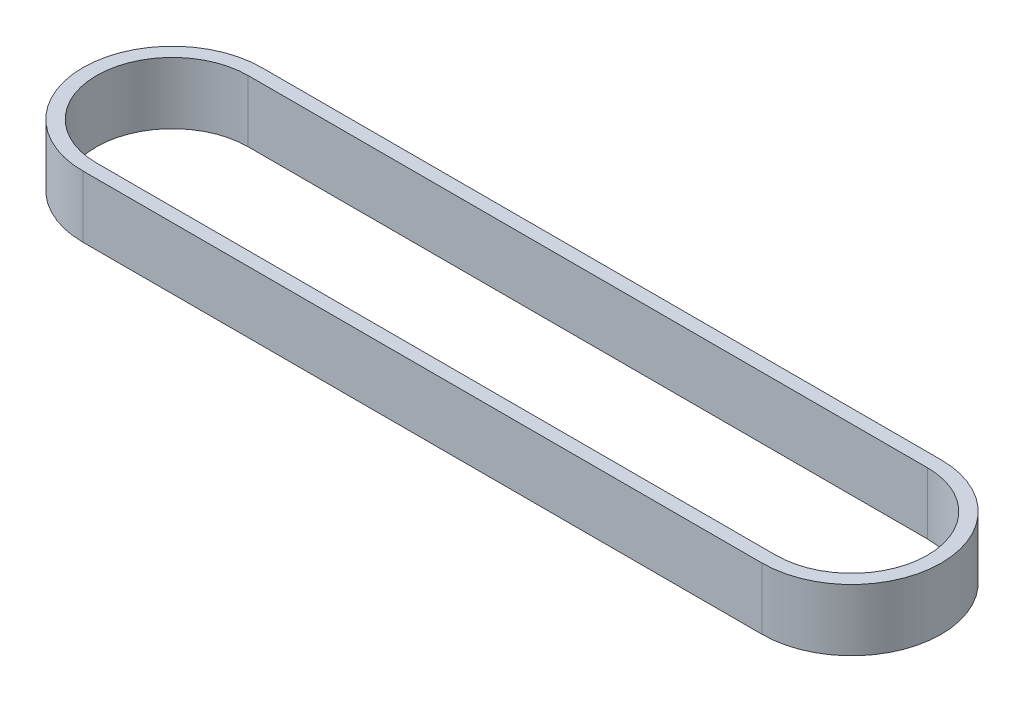
ISO-10303-21;
HEADER;
FILE_DESCRIPTION(('STEP AP214'),'2;1');
FILE_NAME('part.step','',(''),(''),'','','');
FILE_SCHEMA(('AUTOMOTIVE_DESIGN { 1 0 10303 214 1 1 1 1 }'));
ENDSEC;
DATA;
#1=APPLICATION_CONTEXT('core data for automotive mechanical design processes');
#2=APPLICATION_PROTOCOL_DEFINITION('international standard','automotive_design',2000,#1);
#3=PRODUCT_CONTEXT('',#1,'mechanical');
#4=PRODUCT('Part','Part','',(#3));
#5=PRODUCT_RELATED_PRODUCT_CATEGORY('part','',(#4));
#6=PRODUCT_DEFINITION_FORMATION('','',#4);
#7=PRODUCT_DEFINITION_CONTEXT('part definition',#1,'design');
#8=PRODUCT_DEFINITION('design','',#6,#7);
#9=PRODUCT_DEFINITION_SHAPE('','',#8);
#10=(LENGTH_UNIT() NAMED_UNIT(*) SI_UNIT(.MILLI.,.METRE.));
#11=(NAMED_UNIT(*) PLANE_ANGLE_UNIT() SI_UNIT($,.RADIAN.));
#12=(NAMED_UNIT(*) SI_UNIT($,.STERADIAN.) SOLID_ANGLE_UNIT());
#13=UNCERTAINTY_MEASURE_WITH_UNIT(LENGTH_MEASURE(1.E-05),#10,'distance_accuracy_value','');
#14=(GEOMETRIC_REPRESENTATION_CONTEXT(3) GLOBAL_UNCERTAINTY_ASSIGNED_CONTEXT((#13)) GLOBAL_UNIT_ASSIGNED_CONTEXT((#10,
#11,#12)) REPRESENTATION_CONTEXT('',''));
#15=CARTESIAN_POINT('',(0.,0.,0.));
#16=DIRECTION('',(0.,0.,1.));
#17=DIRECTION('',(1.,0.,0.));
#18=AXIS2_PLACEMENT_3D('',#15,#16,#17);
#19=CARTESIAN_POINT('',(49.53,9.,0.));
#20=DIRECTION('',(0.,1.,0.));
#21=DIRECTION('',(0.,0.,1.));
#22=AXIS2_PLACEMENT_3D('',#19,#20,#21);
#23=PLANE('',#22);
#24=CARTESIAN_POINT('',(49.53,9.,0.));
#25=DIRECTION('',(0.,1.,0.));
#26=DIRECTION('',(0.,0.,1.));
#27=AXIS2_PLACEMENT_3D('',#24,#25,#26);
#28=CIRCLE('',#27,13.049);
#29=CARTESIAN_POINT('',(49.53,9.,13.049));
#30=VERTEX_POINT('',#29);
#31=CARTESIAN_POINT('',(49.53,9.,-13.049));
#32=VERTEX_POINT('',#31);
#33=EDGE_CURVE('E134',#30,#32,#28,.T.);
#34=ORIENTED_EDGE('',*,*,#33,.T.);
#35=DIRECTION('',(-1.,0.,0.));
#36=VECTOR('',#35,1.);
#37=CARTESIAN_POINT('',(49.53,9.,-13.049));
#38=LINE('',#37,#36);
#39=CARTESIAN_POINT('',(-49.53,9.,-13.049));
#40=VERTEX_POINT('',#39);
#41=EDGE_CURVE('E137',#32,#40,#38,.T.);
#42=ORIENTED_EDGE('',*,*,#41,.T.);
#43=CARTESIAN_POINT('',(-49.53,9.,0.));
#44=DIRECTION('',(0.,1.,0.));
#45=DIRECTION('',(0.,0.,1.));
#46=AXIS2_PLACEMENT_3D('',#43,#44,#45);
#47=CIRCLE('',#46,13.049);
#48=CARTESIAN_POINT('',(-49.53,9.,13.049));
#49=VERTEX_POINT('',#48);
#50=EDGE_CURVE('E140',#40,#49,#47,.T.);
#51=ORIENTED_EDGE('',*,*,#50,.T.);
#52=DIRECTION('',(1.,0.,0.));
#53=VECTOR('',#52,1.);
#54=CARTESIAN_POINT('',(49.53,9.,13.049));
#55=LINE('',#54,#53);
#56=EDGE_CURVE('E142',#49,#30,#55,.T.);
#57=ORIENTED_EDGE('',*,*,#56,.T.);
#58=EDGE_LOOP('',(#34,#42,#51,#57));
#59=FACE_BOUND('',#58,.T.);
#60=DIRECTION('',(-1.,0.,0.));
#61=VECTOR('',#60,1.);
#62=CARTESIAN_POINT('',(49.53,9.,-11.049));
#63=LINE('',#62,#61);
#64=CARTESIAN_POINT('',(49.53,9.,-11.049));
#65=VERTEX_POINT('',#64);
#66=CARTESIAN_POINT('',(-49.53,9.,-11.049));
#67=VERTEX_POINT('',#66);
#68=EDGE_CURVE('E106',#65,#67,#63,.T.);
#69=ORIENTED_EDGE('',*,*,#68,.F.);
#70=CARTESIAN_POINT('',(49.53,9.,0.));
#71=DIRECTION('',(0.,1.,0.));
#72=DIRECTION('',(0.,0.,1.));
#73=AXIS2_PLACEMENT_3D('',#70,#71,#72);
#74=CIRCLE('',#73,11.049);
#75=CARTESIAN_POINT('',(49.53,9.,11.049));
#76=VERTEX_POINT('',#75);
#77=EDGE_CURVE('E98',#76,#65,#74,.T.);
#78=ORIENTED_EDGE('',*,*,#77,.F.);
#79=DIRECTION('',(1.,0.,0.));
#80=VECTOR('',#79,1.);
#81=CARTESIAN_POINT('',(49.53,9.,11.049));
#82=LINE('',#81,#80);
#83=CARTESIAN_POINT('',(-49.53,9.,11.049));
#84=VERTEX_POINT('',#83);
#85=EDGE_CURVE('E120',#84,#76,#82,.T.);
#86=ORIENTED_EDGE('',*,*,#85,.F.);
#87=CARTESIAN_POINT('',(-49.53,9.,0.));
#88=DIRECTION('',(0.,1.,0.));
#89=DIRECTION('',(0.,0.,1.));
#90=AXIS2_PLACEMENT_3D('',#87,#88,#89);
#91=CIRCLE('',#90,11.049);
#92=EDGE_CURVE('E118',#67,#84,#91,.T.);
#93=ORIENTED_EDGE('',*,*,#92,.F.);
#94=EDGE_LOOP('',(#69,#78,#86,#93));
#95=FACE_BOUND('',#94,.T.);
#96=ADVANCED_FACE('F33',(#59,#95),#23,.T.);
#97=CARTESIAN_POINT('',(49.53,0.,0.));
#98=DIRECTION('',(0.,1.,0.));
#99=DIRECTION('',(0.,0.,1.));
#100=AXIS2_PLACEMENT_3D('',#97,#98,#99);
#101=PLANE('',#100);
#102=CARTESIAN_POINT('',(49.53,0.,0.));
#103=DIRECTION('',(0.,1.,0.));
#104=DIRECTION('',(0.,0.,1.));
#105=AXIS2_PLACEMENT_3D('',#102,#103,#104);
#106=CIRCLE('',#105,13.049);
#107=CARTESIAN_POINT('',(49.53,0.,13.049));
#108=VERTEX_POINT('',#107);
#109=CARTESIAN_POINT('',(49.53,0.,-13.049));
#110=VERTEX_POINT('',#109);
#111=EDGE_CURVE('E114',#108,#110,#106,.T.);
#112=ORIENTED_EDGE('',*,*,#111,.F.);
#113=DIRECTION('',(1.,0.,0.));
#114=VECTOR('',#113,1.);
#115=CARTESIAN_POINT('',(49.53,0.,13.049));
#116=LINE('',#115,#114);
#117=CARTESIAN_POINT('',(-49.53,0.,13.049));
#118=VERTEX_POINT('',#117);
#119=EDGE_CURVE('E138',#118,#108,#116,.T.);
#120=ORIENTED_EDGE('',*,*,#119,.F.);
#121=CARTESIAN_POINT('',(-49.53,0.,0.));
#122=DIRECTION('',(0.,1.,0.));
#123=DIRECTION('',(0.,0.,1.));
#124=AXIS2_PLACEMENT_3D('',#121,#122,#123);
#125=CIRCLE('',#124,13.049);
#126=CARTESIAN_POINT('',(-49.53,0.,-13.049));
#127=VERTEX_POINT('',#126);
#128=EDGE_CURVE('E149',#127,#118,#125,.T.);
#129=ORIENTED_EDGE('',*,*,#128,.F.);
#130=DIRECTION('',(-1.,0.,0.));
#131=VECTOR('',#130,1.);
#132=CARTESIAN_POINT('',(49.53,0.,-13.049));
#133=LINE('',#132,#131);
#134=EDGE_CURVE('E147',#110,#127,#133,.T.);
#135=ORIENTED_EDGE('',*,*,#134,.F.);
#136=EDGE_LOOP('',(#112,#120,#129,#135));
#137=FACE_BOUND('',#136,.T.);
#138=CARTESIAN_POINT('',(49.53,0.,0.));
#139=DIRECTION('',(0.,1.,0.));
#140=DIRECTION('',(0.,0.,1.));
#141=AXIS2_PLACEMENT_3D('',#138,#139,#140);
#142=CIRCLE('',#141,11.049);
#143=CARTESIAN_POINT('',(49.53,0.,11.049));
#144=VERTEX_POINT('',#143);
#145=CARTESIAN_POINT('',(49.53,0.,-11.049));
#146=VERTEX_POINT('',#145);
#147=EDGE_CURVE('E56',#144,#146,#142,.T.);
#148=ORIENTED_EDGE('',*,*,#147,.T.);
#149=DIRECTION('',(-1.,0.,0.));
#150=VECTOR('',#149,1.);
#151=CARTESIAN_POINT('',(49.53,0.,-11.049));
#152=LINE('',#151,#150);
#153=CARTESIAN_POINT('',(-49.53,0.,-11.049));
#154=VERTEX_POINT('',#153);
#155=EDGE_CURVE('E113',#146,#154,#152,.T.);
#156=ORIENTED_EDGE('',*,*,#155,.T.);
#157=CARTESIAN_POINT('',(-49.53,0.,0.));
#158=DIRECTION('',(0.,1.,0.));
#159=DIRECTION('',(0.,0.,1.));
#160=AXIS2_PLACEMENT_3D('',#157,#158,#159);
#161=CIRCLE('',#160,11.049);
#162=CARTESIAN_POINT('',(-49.53,0.,11.049));
#163=VERTEX_POINT('',#162);
#164=EDGE_CURVE('E126',#154,#163,#161,.T.);
#165=ORIENTED_EDGE('',*,*,#164,.T.);
#166=DIRECTION('',(1.,0.,0.));
#167=VECTOR('',#166,1.);
#168=CARTESIAN_POINT('',(49.53,0.,11.049));
#169=LINE('',#168,#167);
#170=EDGE_CURVE('E107',#163,#144,#169,.T.);
#171=ORIENTED_EDGE('',*,*,#170,.T.);
#172=EDGE_LOOP('',(#148,#156,#165,#171));
#173=FACE_BOUND('',#172,.T.);
#174=ADVANCED_FACE('F167',(#137,#173),#101,.F.);
#175=CARTESIAN_POINT('',(49.53,9.,0.));
#176=DIRECTION('',(0.,-1.,0.));
#177=DIRECTION('',(0.,0.,-1.));
#178=AXIS2_PLACEMENT_3D('',#175,#176,#177);
#179=CYLINDRICAL_SURFACE('',#178,13.049);
#180=ORIENTED_EDGE('',*,*,#111,.T.);
#181=DIRECTION('',(0.,-1.,0.));
#182=VECTOR('',#181,1.);
#183=CARTESIAN_POINT('',(49.53,9.,-13.049));
#184=LINE('',#183,#182);
#185=EDGE_CURVE('E11',#32,#110,#184,.T.);
#186=ORIENTED_EDGE('',*,*,#185,.F.);
#187=ORIENTED_EDGE('',*,*,#33,.F.);
#188=DIRECTION('',(0.,-1.,0.));
#189=VECTOR('',#188,1.);
#190=CARTESIAN_POINT('',(49.53,9.,13.049));
#191=LINE('',#190,#189);
#192=EDGE_CURVE('E144',#30,#108,#191,.T.);
#193=ORIENTED_EDGE('',*,*,#192,.T.);
#194=EDGE_LOOP('',(#180,#186,#187,#193));
#195=FACE_BOUND('',#194,.T.);
#196=ADVANCED_FACE('F35',(#195),#179,.T.);
#197=CARTESIAN_POINT('',(49.53,9.,-13.049));
#198=DIRECTION('',(0.,0.,1.));
#199=DIRECTION('',(1.,0.,0.));
#200=AXIS2_PLACEMENT_3D('',#197,#198,#199);
#201=PLANE('',#200);
#202=ORIENTED_EDGE('',*,*,#134,.T.);
#203=DIRECTION('',(0.,-1.,0.));
#204=VECTOR('',#203,1.);
#205=CARTESIAN_POINT('',(-49.53,9.,-13.049));
#206=LINE('',#205,#204);
#207=EDGE_CURVE('E41',#40,#127,#206,.T.);
#208=ORIENTED_EDGE('',*,*,#207,.F.);
#209=ORIENTED_EDGE('',*,*,#41,.F.);
#210=ORIENTED_EDGE('',*,*,#185,.T.);
#211=EDGE_LOOP('',(#202,#208,#209,#210));
#212=FACE_BOUND('',#211,.T.);
#213=ADVANCED_FACE('F177',(#212),#201,.F.);
#214=CARTESIAN_POINT('',(-49.53,9.,0.));
#215=DIRECTION('',(0.,-1.,0.));
#216=DIRECTION('',(0.,0.,-1.));
#217=AXIS2_PLACEMENT_3D('',#214,#215,#216);
#218=CYLINDRICAL_SURFACE('',#217,13.049);
#219=ORIENTED_EDGE('',*,*,#128,.T.);
#220=DIRECTION('',(0.,-1.,0.));
#221=VECTOR('',#220,1.);
#222=CARTESIAN_POINT('',(-49.53,9.,13.049));
#223=LINE('',#222,#221);
#224=EDGE_CURVE('E154',#49,#118,#223,.T.);
#225=ORIENTED_EDGE('',*,*,#224,.F.);
#226=ORIENTED_EDGE('',*,*,#50,.F.);
#227=ORIENTED_EDGE('',*,*,#207,.T.);
#228=EDGE_LOOP('',(#219,#225,#226,#227));
#229=FACE_BOUND('',#228,.T.);
#230=ADVANCED_FACE('F161',(#229),#218,.T.);
#231=CARTESIAN_POINT('',(49.53,9.,13.049));
#232=DIRECTION('',(0.,0.,-1.));
#233=DIRECTION('',(-1.,0.,0.));
#234=AXIS2_PLACEMENT_3D('',#231,#232,#233);
#235=PLANE('',#234);
#236=ORIENTED_EDGE('',*,*,#119,.T.);
#237=ORIENTED_EDGE('',*,*,#192,.F.);
#238=ORIENTED_EDGE('',*,*,#56,.F.);
#239=ORIENTED_EDGE('',*,*,#224,.T.);
#240=EDGE_LOOP('',(#236,#237,#238,#239));
#241=FACE_BOUND('',#240,.T.);
#242=ADVANCED_FACE('F171',(#241),#235,.F.);
#243=CARTESIAN_POINT('',(49.53,9.,0.));
#244=DIRECTION('',(0.,-1.,0.));
#245=DIRECTION('',(0.,0.,-1.));
#246=AXIS2_PLACEMENT_3D('',#243,#244,#245);
#247=CYLINDRICAL_SURFACE('',#246,11.049);
#248=ORIENTED_EDGE('',*,*,#147,.F.);
#249=DIRECTION('',(0.,-1.,0.));
#250=VECTOR('',#249,1.);
#251=CARTESIAN_POINT('',(49.53,9.,11.049));
#252=LINE('',#251,#250);
#253=EDGE_CURVE('E102',#76,#144,#252,.T.);
#254=ORIENTED_EDGE('',*,*,#253,.F.);
#255=ORIENTED_EDGE('',*,*,#77,.T.);
#256=DIRECTION('',(0.,-1.,0.));
#257=VECTOR('',#256,1.);
#258=CARTESIAN_POINT('',(49.53,9.,-11.049));
#259=LINE('',#258,#257);
#260=EDGE_CURVE('E101',#65,#146,#259,.T.);
#261=ORIENTED_EDGE('',*,*,#260,.T.);
#262=EDGE_LOOP('',(#248,#254,#255,#261));
#263=FACE_BOUND('',#262,.T.);
#264=ADVANCED_FACE('F100',(#263),#247,.F.);
#265=CARTESIAN_POINT('',(49.53,9.,-11.049));
#266=DIRECTION('',(0.,0.,1.));
#267=DIRECTION('',(1.,0.,0.));
#268=AXIS2_PLACEMENT_3D('',#265,#266,#267);
#269=PLANE('',#268);
#270=ORIENTED_EDGE('',*,*,#155,.F.);
#271=ORIENTED_EDGE('',*,*,#260,.F.);
#272=ORIENTED_EDGE('',*,*,#68,.T.);
#273=DIRECTION('',(0.,-1.,0.));
#274=VECTOR('',#273,1.);
#275=CARTESIAN_POINT('',(-49.53,9.,-11.049));
#276=LINE('',#275,#274);
#277=EDGE_CURVE('E115',#67,#154,#276,.T.);
#278=ORIENTED_EDGE('',*,*,#277,.T.);
#279=EDGE_LOOP('',(#270,#271,#272,#278));
#280=FACE_BOUND('',#279,.T.);
#281=ADVANCED_FACE('F110',(#280),#269,.T.);
#282=CARTESIAN_POINT('',(-49.53,9.,0.));
#283=DIRECTION('',(0.,-1.,0.));
#284=DIRECTION('',(0.,0.,-1.));
#285=AXIS2_PLACEMENT_3D('',#282,#283,#284);
#286=CYLINDRICAL_SURFACE('',#285,11.049);
#287=ORIENTED_EDGE('',*,*,#164,.F.);
#288=ORIENTED_EDGE('',*,*,#277,.F.);
#289=ORIENTED_EDGE('',*,*,#92,.T.);
#290=DIRECTION('',(0.,-1.,0.));
#291=VECTOR('',#290,1.);
#292=CARTESIAN_POINT('',(-49.53,9.,11.049));
#293=LINE('',#292,#291);
#294=EDGE_CURVE('E48',#84,#163,#293,.T.);
#295=ORIENTED_EDGE('',*,*,#294,.T.);
#296=EDGE_LOOP('',(#287,#288,#289,#295));
#297=FACE_BOUND('',#296,.T.);
#298=ADVANCED_FACE('F200',(#297),#286,.F.);
#299=CARTESIAN_POINT('',(49.53,9.,11.049));
#300=DIRECTION('',(0.,0.,-1.));
#301=DIRECTION('',(-1.,0.,0.));
#302=AXIS2_PLACEMENT_3D('',#299,#300,#301);
#303=PLANE('',#302);
#304=ORIENTED_EDGE('',*,*,#170,.F.);
#305=ORIENTED_EDGE('',*,*,#294,.F.);
#306=ORIENTED_EDGE('',*,*,#85,.T.);
#307=ORIENTED_EDGE('',*,*,#253,.T.);
#308=EDGE_LOOP('',(#304,#305,#306,#307));
#309=FACE_BOUND('',#308,.T.);
#310=ADVANCED_FACE('F204',(#309),#303,.T.);
#311=CLOSED_SHELL('',(#96,#174,#196,#213,#230,#242,#264,#281,#298,#310));
#312=MANIFOLD_SOLID_BREP('B2',#311);
#313=ADVANCED_BREP_SHAPE_REPRESENTATION('',(#18,#312),#14);
#314=SHAPE_DEFINITION_REPRESENTATION(#9,#313);
ENDSEC;
END-ISO-10303-21;
